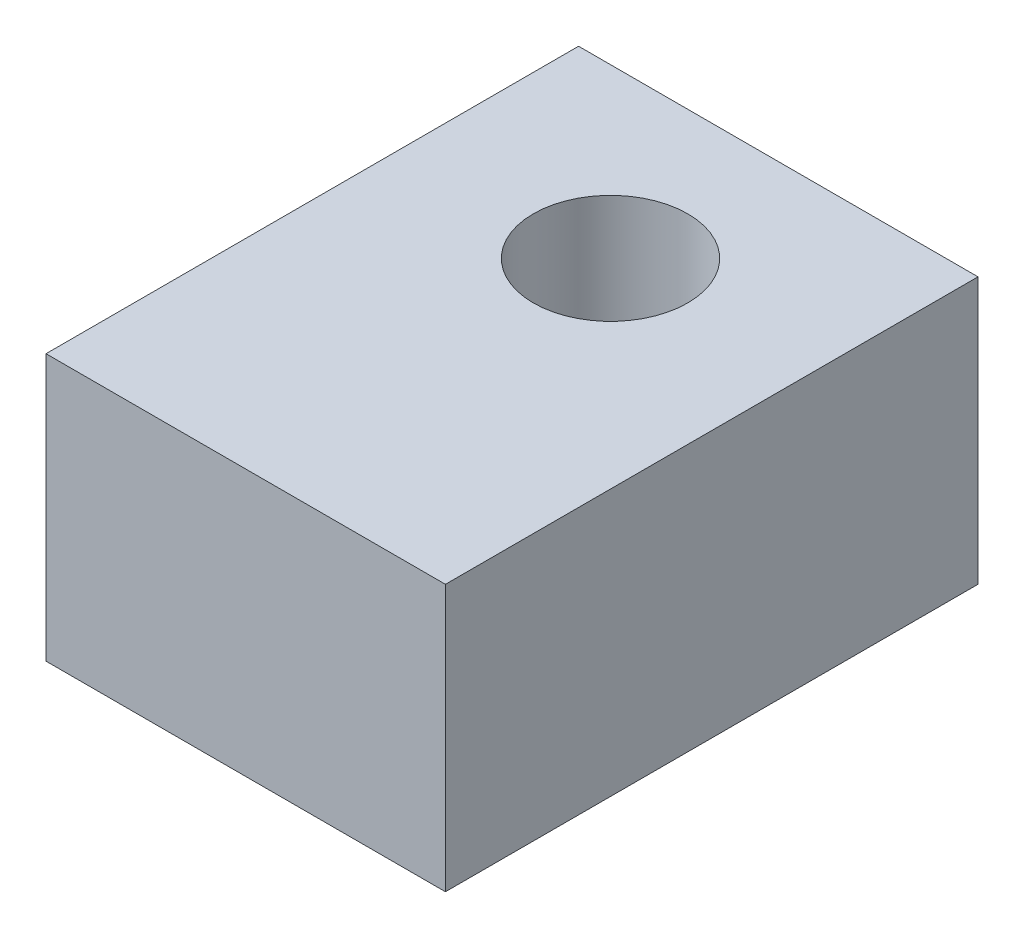
ISO-10303-21;
HEADER;
FILE_DESCRIPTION(('STEP AP214'),'2;1');
FILE_NAME('part.step','',(''),(''),'','','');
FILE_SCHEMA(('AUTOMOTIVE_DESIGN { 1 0 10303 214 1 1 1 1 }'));
ENDSEC;
DATA;
#1=APPLICATION_CONTEXT('core data for automotive mechanical design processes');
#2=APPLICATION_PROTOCOL_DEFINITION('international standard','automotive_design',2000,#1);
#3=PRODUCT_CONTEXT('',#1,'mechanical');
#4=PRODUCT('Part','Part','',(#3));
#5=PRODUCT_RELATED_PRODUCT_CATEGORY('part','',(#4));
#6=PRODUCT_DEFINITION_FORMATION('','',#4);
#7=PRODUCT_DEFINITION_CONTEXT('part definition',#1,'design');
#8=PRODUCT_DEFINITION('design','',#6,#7);
#9=PRODUCT_DEFINITION_SHAPE('','',#8);
#10=(LENGTH_UNIT() NAMED_UNIT(*) SI_UNIT(.MILLI.,.METRE.));
#11=(NAMED_UNIT(*) PLANE_ANGLE_UNIT() SI_UNIT($,.RADIAN.));
#12=(NAMED_UNIT(*) SI_UNIT($,.STERADIAN.) SOLID_ANGLE_UNIT());
#13=UNCERTAINTY_MEASURE_WITH_UNIT(LENGTH_MEASURE(1.E-05),#10,'distance_accuracy_value','');
#14=(GEOMETRIC_REPRESENTATION_CONTEXT(3) GLOBAL_UNCERTAINTY_ASSIGNED_CONTEXT((#13)) GLOBAL_UNIT_ASSIGNED_CONTEXT((#10,
#11,#12)) REPRESENTATION_CONTEXT('',''));
#15=CARTESIAN_POINT('',(0.,0.,0.));
#16=DIRECTION('',(0.,0.,1.));
#17=DIRECTION('',(1.,0.,0.));
#18=AXIS2_PLACEMENT_3D('',#15,#16,#17);
#19=CARTESIAN_POINT('',(0.,0.,20.));
#20=DIRECTION('',(0.,1.,0.));
#21=DIRECTION('',(-1.,0.,0.));
#22=AXIS2_PLACEMENT_3D('',#19,#20,#21);
#23=PLANE('',#22);
#24=CARTESIAN_POINT('',(-7.5,0.,6.3));
#25=DIRECTION('',(0.,1.,0.));
#26=DIRECTION('',(-1.,0.,0.));
#27=AXIS2_PLACEMENT_3D('',#24,#25,#26);
#28=CIRCLE('',#27,2.9);
#29=CARTESIAN_POINT('',(-10.4,0.,6.3));
#30=VERTEX_POINT('',#29);
#31=EDGE_CURVE('E117',#30,#30,#28,.T.);
#32=ORIENTED_EDGE('',*,*,#31,.T.);
#33=EDGE_LOOP('',(#32));
#34=FACE_BOUND('',#33,.T.);
#35=DIRECTION('',(1.,0.,0.));
#36=VECTOR('',#35,1.);
#37=CARTESIAN_POINT('',(0.,0.,0.));
#38=LINE('',#37,#36);
#39=CARTESIAN_POINT('',(-15.,0.,0.));
#40=VERTEX_POINT('',#39);
#41=CARTESIAN_POINT('',(0.,0.,0.));
#42=VERTEX_POINT('',#41);
#43=EDGE_CURVE('E113',#40,#42,#38,.T.);
#44=ORIENTED_EDGE('',*,*,#43,.T.);
#45=DIRECTION('',(0.,0.,-1.));
#46=VECTOR('',#45,1.);
#47=CARTESIAN_POINT('',(0.,0.,20.));
#48=LINE('',#47,#46);
#49=CARTESIAN_POINT('',(0.,0.,20.));
#50=VERTEX_POINT('',#49);
#51=EDGE_CURVE('E11',#50,#42,#48,.T.);
#52=ORIENTED_EDGE('',*,*,#51,.F.);
#53=DIRECTION('',(1.,0.,0.));
#54=VECTOR('',#53,1.);
#55=CARTESIAN_POINT('',(0.,0.,20.));
#56=LINE('',#55,#54);
#57=CARTESIAN_POINT('',(-15.,0.,20.));
#58=VERTEX_POINT('',#57);
#59=EDGE_CURVE('E97',#58,#50,#56,.T.);
#60=ORIENTED_EDGE('',*,*,#59,.F.);
#61=DIRECTION('',(0.,0.,-1.));
#62=VECTOR('',#61,1.);
#63=CARTESIAN_POINT('',(-15.,0.,20.));
#64=LINE('',#63,#62);
#65=EDGE_CURVE('E109',#58,#40,#64,.T.);
#66=ORIENTED_EDGE('',*,*,#65,.T.);
#67=EDGE_LOOP('',(#44,#52,#60,#66));
#68=FACE_BOUND('',#67,.T.);
#69=ADVANCED_FACE('F45',(#34,#68),#23,.F.);
#70=CARTESIAN_POINT('',(0.,0.,20.));
#71=DIRECTION('',(-1.,0.,0.));
#72=DIRECTION('',(0.,0.,1.));
#73=AXIS2_PLACEMENT_3D('',#70,#71,#72);
#74=PLANE('',#73);
#75=DIRECTION('',(0.,1.,0.));
#76=VECTOR('',#75,1.);
#77=CARTESIAN_POINT('',(0.,0.,0.));
#78=LINE('',#77,#76);
#79=CARTESIAN_POINT('',(0.,10.,0.));
#80=VERTEX_POINT('',#79);
#81=EDGE_CURVE('E102',#42,#80,#78,.T.);
#82=ORIENTED_EDGE('',*,*,#81,.T.);
#83=DIRECTION('',(0.,0.,-1.));
#84=VECTOR('',#83,1.);
#85=CARTESIAN_POINT('',(0.,10.,20.));
#86=LINE('',#85,#84);
#87=CARTESIAN_POINT('',(0.,10.,20.));
#88=VERTEX_POINT('',#87);
#89=EDGE_CURVE('E54',#88,#80,#86,.T.);
#90=ORIENTED_EDGE('',*,*,#89,.F.);
#91=DIRECTION('',(0.,1.,0.));
#92=VECTOR('',#91,1.);
#93=CARTESIAN_POINT('',(0.,0.,20.));
#94=LINE('',#93,#92);
#95=EDGE_CURVE('E92',#50,#88,#94,.T.);
#96=ORIENTED_EDGE('',*,*,#95,.F.);
#97=ORIENTED_EDGE('',*,*,#51,.T.);
#98=EDGE_LOOP('',(#82,#90,#96,#97));
#99=FACE_BOUND('',#98,.T.);
#100=ADVANCED_FACE('F101',(#99),#74,.F.);
#101=CARTESIAN_POINT('',(0.,10.,20.));
#102=DIRECTION('',(0.,-1.,0.));
#103=DIRECTION('',(1.,0.,0.));
#104=AXIS2_PLACEMENT_3D('',#101,#102,#103);
#105=PLANE('',#104);
#106=CARTESIAN_POINT('',(-7.5,10.,6.3));
#107=DIRECTION('',(0.,1.,0.));
#108=DIRECTION('',(-1.,0.,0.));
#109=AXIS2_PLACEMENT_3D('',#106,#107,#108);
#110=CIRCLE('',#109,2.9);
#111=CARTESIAN_POINT('',(-10.4,10.,6.3));
#112=VERTEX_POINT('',#111);
#113=EDGE_CURVE('E134',#112,#112,#110,.T.);
#114=ORIENTED_EDGE('',*,*,#113,.F.);
#115=EDGE_LOOP('',(#114));
#116=FACE_BOUND('',#115,.T.);
#117=DIRECTION('',(-1.,0.,0.));
#118=VECTOR('',#117,1.);
#119=CARTESIAN_POINT('',(0.,10.,0.));
#120=LINE('',#119,#118);
#121=CARTESIAN_POINT('',(-15.,10.,0.));
#122=VERTEX_POINT('',#121);
#123=EDGE_CURVE('E79',#80,#122,#120,.T.);
#124=ORIENTED_EDGE('',*,*,#123,.T.);
#125=DIRECTION('',(0.,0.,-1.));
#126=VECTOR('',#125,1.);
#127=CARTESIAN_POINT('',(-15.,10.,20.));
#128=LINE('',#127,#126);
#129=CARTESIAN_POINT('',(-15.,10.,20.));
#130=VERTEX_POINT('',#129);
#131=EDGE_CURVE('E104',#130,#122,#128,.T.);
#132=ORIENTED_EDGE('',*,*,#131,.F.);
#133=DIRECTION('',(-1.,0.,0.));
#134=VECTOR('',#133,1.);
#135=CARTESIAN_POINT('',(0.,10.,20.));
#136=LINE('',#135,#134);
#137=EDGE_CURVE('E95',#88,#130,#136,.T.);
#138=ORIENTED_EDGE('',*,*,#137,.F.);
#139=ORIENTED_EDGE('',*,*,#89,.T.);
#140=EDGE_LOOP('',(#124,#132,#138,#139));
#141=FACE_BOUND('',#140,.T.);
#142=ADVANCED_FACE('F105',(#116,#141),#105,.F.);
#143=CARTESIAN_POINT('',(-15.,0.,20.));
#144=DIRECTION('',(1.,0.,0.));
#145=DIRECTION('',(0.,0.,-1.));
#146=AXIS2_PLACEMENT_3D('',#143,#144,#145);
#147=PLANE('',#146);
#148=DIRECTION('',(0.,-1.,0.));
#149=VECTOR('',#148,1.);
#150=CARTESIAN_POINT('',(-15.,0.,0.));
#151=LINE('',#150,#149);
#152=EDGE_CURVE('E85',#122,#40,#151,.T.);
#153=ORIENTED_EDGE('',*,*,#152,.T.);
#154=ORIENTED_EDGE('',*,*,#65,.F.);
#155=DIRECTION('',(0.,-1.,0.));
#156=VECTOR('',#155,1.);
#157=CARTESIAN_POINT('',(-15.,0.,20.));
#158=LINE('',#157,#156);
#159=EDGE_CURVE('E62',#130,#58,#158,.T.);
#160=ORIENTED_EDGE('',*,*,#159,.F.);
#161=ORIENTED_EDGE('',*,*,#131,.T.);
#162=EDGE_LOOP('',(#153,#154,#160,#161));
#163=FACE_BOUND('',#162,.T.);
#164=ADVANCED_FACE('F127',(#163),#147,.F.);
#165=CARTESIAN_POINT('',(0.,0.,20.));
#166=DIRECTION('',(0.,0.,-1.));
#167=DIRECTION('',(-1.,0.,0.));
#168=AXIS2_PLACEMENT_3D('',#165,#166,#167);
#169=PLANE('',#168);
#170=ORIENTED_EDGE('',*,*,#59,.T.);
#171=ORIENTED_EDGE('',*,*,#95,.T.);
#172=ORIENTED_EDGE('',*,*,#137,.T.);
#173=ORIENTED_EDGE('',*,*,#159,.T.);
#174=EDGE_LOOP('',(#170,#171,#172,#173));
#175=FACE_BOUND('',#174,.T.);
#176=ADVANCED_FACE('F93',(#175),#169,.F.);
#177=CARTESIAN_POINT('',(0.,0.,0.));
#178=DIRECTION('',(0.,0.,-1.));
#179=DIRECTION('',(-1.,0.,0.));
#180=AXIS2_PLACEMENT_3D('',#177,#178,#179);
#181=PLANE('',#180);
#182=ORIENTED_EDGE('',*,*,#43,.F.);
#183=ORIENTED_EDGE('',*,*,#152,.F.);
#184=ORIENTED_EDGE('',*,*,#123,.F.);
#185=ORIENTED_EDGE('',*,*,#81,.F.);
#186=EDGE_LOOP('',(#182,#183,#184,#185));
#187=FACE_BOUND('',#186,.T.);
#188=ADVANCED_FACE('F130',(#187),#181,.T.);
#189=CARTESIAN_POINT('',(-7.5,0.,6.3));
#190=DIRECTION('',(0.,1.,0.));
#191=DIRECTION('',(-1.,0.,0.));
#192=AXIS2_PLACEMENT_3D('',#189,#190,#191);
#193=CYLINDRICAL_SURFACE('',#192,2.9);
#194=CARTESIAN_POINT('',(-10.4,0.,6.3));
#195=CARTESIAN_POINT('',(-10.4,0.104166666666661,6.3));
#196=CARTESIAN_POINT('',(-10.4,0.208333333333328,6.3));
#197=CARTESIAN_POINT('',(-10.4,0.416666666666661,6.3));
#198=CARTESIAN_POINT('',(-10.4,0.520833333333328,6.3));
#199=CARTESIAN_POINT('',(-10.4,0.729166666666661,6.3));
#200=CARTESIAN_POINT('',(-10.4,0.833333333333328,6.3));
#201=CARTESIAN_POINT('',(-10.4,1.04166666666666,6.3));
#202=CARTESIAN_POINT('',(-10.4,1.14583333333333,6.3));
#203=CARTESIAN_POINT('',(-10.4,1.35416666666666,6.3));
#204=CARTESIAN_POINT('',(-10.4,1.45833333333333,6.3));
#205=CARTESIAN_POINT('',(-10.4,1.66666666666666,6.3));
#206=CARTESIAN_POINT('',(-10.4,1.77083333333333,6.3));
#207=CARTESIAN_POINT('',(-10.4,1.97916666666666,6.3));
#208=CARTESIAN_POINT('',(-10.4,2.08333333333333,6.3));
#209=CARTESIAN_POINT('',(-10.4,2.29166666666666,6.3));
#210=CARTESIAN_POINT('',(-10.4,2.39583333333333,6.3));
#211=CARTESIAN_POINT('',(-10.4,2.60416666666666,6.3));
#212=CARTESIAN_POINT('',(-10.4,2.70833333333333,6.3));
#213=CARTESIAN_POINT('',(-10.4,2.91666666666666,6.3));
#214=CARTESIAN_POINT('',(-10.4,3.02083333333333,6.3));
#215=CARTESIAN_POINT('',(-10.4,3.22916666666666,6.3));
#216=CARTESIAN_POINT('',(-10.4,3.33333333333333,6.3));
#217=CARTESIAN_POINT('',(-10.4,3.54166666666666,6.3));
#218=CARTESIAN_POINT('',(-10.4,3.64583333333333,6.3));
#219=CARTESIAN_POINT('',(-10.4,3.85416666666666,6.3));
#220=CARTESIAN_POINT('',(-10.4,3.95833333333333,6.3));
#221=CARTESIAN_POINT('',(-10.4,4.16666666666666,6.3));
#222=CARTESIAN_POINT('',(-10.4,4.27083333333333,6.3));
#223=CARTESIAN_POINT('',(-10.4,4.47916666666666,6.3));
#224=CARTESIAN_POINT('',(-10.4,4.58333333333333,6.3));
#225=CARTESIAN_POINT('',(-10.4,4.79166666666666,6.3));
#226=CARTESIAN_POINT('',(-10.4,4.89583333333333,6.3));
#227=CARTESIAN_POINT('',(-10.4,5.10416666666666,6.3));
#228=CARTESIAN_POINT('',(-10.4,5.20833333333333,6.3));
#229=CARTESIAN_POINT('',(-10.4,5.41666666666666,6.3));
#230=CARTESIAN_POINT('',(-10.4,5.52083333333333,6.3));
#231=CARTESIAN_POINT('',(-10.4,5.72916666666666,6.3));
#232=CARTESIAN_POINT('',(-10.4,5.83333333333333,6.3));
#233=CARTESIAN_POINT('',(-10.4,6.04166666666666,6.3));
#234=CARTESIAN_POINT('',(-10.4,6.14583333333333,6.3));
#235=CARTESIAN_POINT('',(-10.4,6.35416666666666,6.3));
#236=CARTESIAN_POINT('',(-10.4,6.45833333333333,6.3));
#237=CARTESIAN_POINT('',(-10.4,6.66666666666666,6.3));
#238=CARTESIAN_POINT('',(-10.4,6.77083333333333,6.3));
#239=CARTESIAN_POINT('',(-10.4,6.97916666666666,6.3));
#240=CARTESIAN_POINT('',(-10.4,7.08333333333333,6.3));
#241=CARTESIAN_POINT('',(-10.4,7.29166666666666,6.3));
#242=CARTESIAN_POINT('',(-10.4,7.39583333333333,6.3));
#243=CARTESIAN_POINT('',(-10.4,7.60416666666666,6.3));
#244=CARTESIAN_POINT('',(-10.4,7.70833333333333,6.3));
#245=CARTESIAN_POINT('',(-10.4,7.91666666666666,6.3));
#246=CARTESIAN_POINT('',(-10.4,8.02083333333333,6.3));
#247=CARTESIAN_POINT('',(-10.4,8.22916666666666,6.3));
#248=CARTESIAN_POINT('',(-10.4,8.33333333333333,6.3));
#249=CARTESIAN_POINT('',(-10.4,8.54166666666666,6.3));
#250=CARTESIAN_POINT('',(-10.4,8.64583333333333,6.3));
#251=CARTESIAN_POINT('',(-10.4,8.85416666666666,6.3));
#252=CARTESIAN_POINT('',(-10.4,8.95833333333333,6.3));
#253=CARTESIAN_POINT('',(-10.4,9.16666666666666,6.3));
#254=CARTESIAN_POINT('',(-10.4,9.27083333333333,6.3));
#255=CARTESIAN_POINT('',(-10.4,9.47916666666667,6.3));
#256=CARTESIAN_POINT('',(-10.4,9.58333333333333,6.3));
#257=CARTESIAN_POINT('',(-10.4,9.79166666666667,6.3));
#258=CARTESIAN_POINT('',(-10.4,9.89583333333333,6.3));
#259=CARTESIAN_POINT('',(-10.4,10.,6.3));
#260=B_SPLINE_CURVE_WITH_KNOTS('',3,(#194,#195,#196,#197,#198,#199,#200,#201,#202,#203,#204,
#205,#206,#207,#208,#209,#210,#211,#212,#213,#214,#215,#216,#217,#218,#219,#220,#221,#222,#223,
#224,#225,#226,#227,#228,#229,#230,#231,#232,#233,#234,#235,#236,#237,#238,#239,#240,#241,#242,
#243,#244,#245,#246,#247,#248,#249,#250,#251,#252,#253,#254,#255,#256,#257,#258,#259),
.UNSPECIFIED.,.F.,.F.,(4,2,2,2,2,2,2,2,2,2,2,2,2,2,2,2,2,2,2,2,2,2,2,2,2,2,2,2,2,2,2,2,4),(0.,
0.3125,0.625,0.9375,1.25,1.5625,1.875,2.1875,2.5,2.8125,3.125,3.4375,3.75,4.0625,4.375,4.6875,
5.,5.3125,5.625,5.9375,6.25,6.5625,6.875,7.1875,7.5,7.8125,8.125,8.4375,8.75,9.0625,9.375,
9.6875,10.),.UNSPECIFIED.);
#261=EDGE_CURVE('BSEAM143',#30,#112,#260,.T.);
#262=ORIENTED_EDGE('',*,*,#31,.F.);
#263=ORIENTED_EDGE('',*,*,#113,.T.);
#264=ORIENTED_EDGE('',*,*,#261,.T.);
#265=ORIENTED_EDGE('',*,*,#261,.F.);
#266=EDGE_LOOP('',(#262,#264,#263,#265));
#267=FACE_BOUND('',#266,.T.);
#268=ADVANCED_FACE('F143',(#267),#193,.F.);
#269=CLOSED_SHELL('',(#69,#100,#142,#164,#176,#188,#268));
#270=MANIFOLD_SOLID_BREP('B2',#269);
#271=ADVANCED_BREP_SHAPE_REPRESENTATION('',(#18,#270),#14);
#272=SHAPE_DEFINITION_REPRESENTATION(#9,#271);
ENDSEC;
END-ISO-10303-21;
